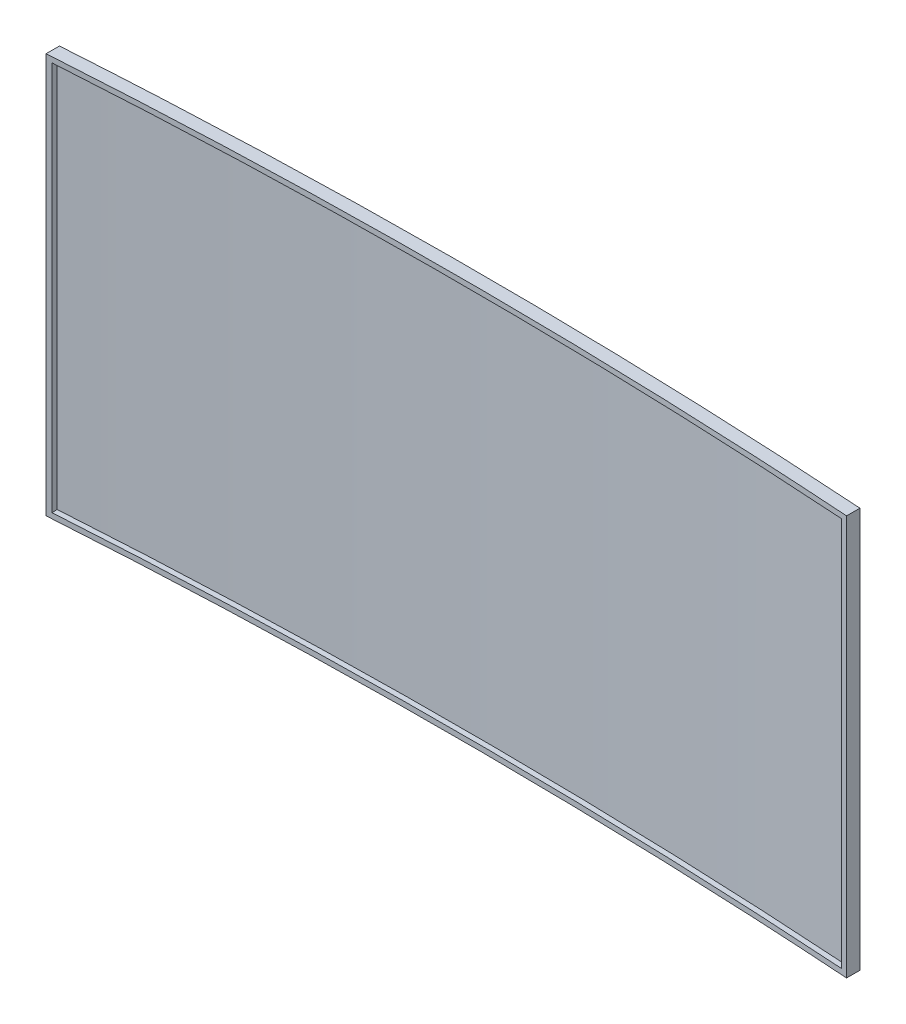
ISO-10303-21;
HEADER;
FILE_DESCRIPTION(('STEP AP214'),'2;1');
FILE_NAME('part.step','',(''),(''),'','','');
FILE_SCHEMA(('AUTOMOTIVE_DESIGN { 1 0 10303 214 1 1 1 1 }'));
ENDSEC;
DATA;
#1=APPLICATION_CONTEXT('core data for automotive mechanical design processes');
#2=APPLICATION_PROTOCOL_DEFINITION('international standard','automotive_design',2000,#1);
#3=PRODUCT_CONTEXT('',#1,'mechanical');
#4=PRODUCT('Part','Part','',(#3));
#5=PRODUCT_RELATED_PRODUCT_CATEGORY('part','',(#4));
#6=PRODUCT_DEFINITION_FORMATION('','',#4);
#7=PRODUCT_DEFINITION_CONTEXT('part definition',#1,'design');
#8=PRODUCT_DEFINITION('design','',#6,#7);
#9=PRODUCT_DEFINITION_SHAPE('','',#8);
#10=(LENGTH_UNIT() NAMED_UNIT(*) SI_UNIT(.MILLI.,.METRE.));
#11=(NAMED_UNIT(*) PLANE_ANGLE_UNIT() SI_UNIT($,.RADIAN.));
#12=(NAMED_UNIT(*) SI_UNIT($,.STERADIAN.) SOLID_ANGLE_UNIT());
#13=UNCERTAINTY_MEASURE_WITH_UNIT(LENGTH_MEASURE(1.E-05),#10,'distance_accuracy_value','');
#14=(GEOMETRIC_REPRESENTATION_CONTEXT(3) GLOBAL_UNCERTAINTY_ASSIGNED_CONTEXT((#13)) GLOBAL_UNIT_ASSIGNED_CONTEXT((#10,
#11,#12)) REPRESENTATION_CONTEXT('',''));
#15=CARTESIAN_POINT('',(0.,0.,0.));
#16=DIRECTION('',(0.,0.,1.));
#17=DIRECTION('',(1.,0.,0.));
#18=AXIS2_PLACEMENT_3D('',#15,#16,#17);
#19=CARTESIAN_POINT('',(-26.,100.,-30.4371187248251));
#20=DIRECTION('',(0.,0.,1.));
#21=DIRECTION('',(1.,0.,0.));
#22=AXIS2_PLACEMENT_3D('',#19,#20,#21);
#23=PLANE('',#22);
#24=CARTESIAN_POINT('',(0.,74.,-30.4371187248251));
#25=DIRECTION('',(0.,0.,-1.));
#26=DIRECTION('',(-1.,0.,0.));
#27=AXIS2_PLACEMENT_3D('',#24,#25,#26);
#28=CIRCLE('',#27,25.);
#29=CARTESIAN_POINT('',(-25.,74.,-30.4371187248251));
#30=VERTEX_POINT('',#29);
#31=EDGE_CURVE('E511',#30,#30,#28,.T.);
#32=ORIENTED_EDGE('',*,*,#31,.F.);
#33=EDGE_LOOP('',(#32));
#34=FACE_BOUND('',#33,.T.);
#35=DIRECTION('',(0.,-1.,0.));
#36=VECTOR('',#35,1.);
#37=CARTESIAN_POINT('',(-26.,100.,-30.4371187248251));
#38=LINE('',#37,#36);
#39=CARTESIAN_POINT('',(-26.,90.,-30.4371187248251));
#40=VERTEX_POINT('',#39);
#41=CARTESIAN_POINT('',(-26.,58.,-30.4371187248251));
#42=VERTEX_POINT('',#41);
#43=EDGE_CURVE('E238',#40,#42,#38,.T.);
#44=ORIENTED_EDGE('',*,*,#43,.F.);
#45=CARTESIAN_POINT('',(-16.,90.,-30.4371187248251));
#46=DIRECTION('',(0.,0.,1.));
#47=DIRECTION('',(1.,0.,0.));
#48=AXIS2_PLACEMENT_3D('',#45,#46,#47);
#49=CIRCLE('',#48,10.);
#50=CARTESIAN_POINT('',(-16.,100.,-30.4371187248251));
#51=VERTEX_POINT('',#50);
#52=EDGE_CURVE('E480',#40,#51,#49,.F.);
#53=ORIENTED_EDGE('',*,*,#52,.T.);
#54=DIRECTION('',(-1.,0.,0.));
#55=VECTOR('',#54,1.);
#56=CARTESIAN_POINT('',(-26.,100.,-30.4371187248251));
#57=LINE('',#56,#55);
#58=CARTESIAN_POINT('',(16.,100.,-30.4371187248251));
#59=VERTEX_POINT('',#58);
#60=EDGE_CURVE('E233',#59,#51,#57,.T.);
#61=ORIENTED_EDGE('',*,*,#60,.F.);
#62=CARTESIAN_POINT('',(16.,90.,-30.4371187248251));
#63=DIRECTION('',(0.,0.,1.));
#64=DIRECTION('',(1.,0.,0.));
#65=AXIS2_PLACEMENT_3D('',#62,#63,#64);
#66=CIRCLE('',#65,10.);
#67=CARTESIAN_POINT('',(26.,90.,-30.4371187248251));
#68=VERTEX_POINT('',#67);
#69=EDGE_CURVE('E471',#59,#68,#66,.F.);
#70=ORIENTED_EDGE('',*,*,#69,.T.);
#71=DIRECTION('',(0.,-1.,0.));
#72=VECTOR('',#71,1.);
#73=CARTESIAN_POINT('',(26.,100.,-30.4371187248251));
#74=LINE('',#73,#72);
#75=CARTESIAN_POINT('',(26.,58.,-30.4371187248251));
#76=VERTEX_POINT('',#75);
#77=EDGE_CURVE('E245',#68,#76,#74,.T.);
#78=ORIENTED_EDGE('',*,*,#77,.T.);
#79=CARTESIAN_POINT('',(16.,58.,-30.4371187248251));
#80=DIRECTION('',(0.,0.,1.));
#81=DIRECTION('',(1.,0.,0.));
#82=AXIS2_PLACEMENT_3D('',#79,#80,#81);
#83=CIRCLE('',#82,10.);
#84=CARTESIAN_POINT('',(16.,48.,-30.4371187248251));
#85=VERTEX_POINT('',#84);
#86=EDGE_CURVE('E474',#76,#85,#83,.F.);
#87=ORIENTED_EDGE('',*,*,#86,.T.);
#88=DIRECTION('',(1.,0.,0.));
#89=VECTOR('',#88,1.);
#90=CARTESIAN_POINT('',(26.,48.,-30.4371187248251));
#91=LINE('',#90,#89);
#92=CARTESIAN_POINT('',(-16.,48.,-30.4371187248251));
#93=VERTEX_POINT('',#92);
#94=EDGE_CURVE('E214',#93,#85,#91,.T.);
#95=ORIENTED_EDGE('',*,*,#94,.F.);
#96=CARTESIAN_POINT('',(-16.,58.,-30.4371187248251));
#97=DIRECTION('',(0.,0.,1.));
#98=DIRECTION('',(1.,0.,0.));
#99=AXIS2_PLACEMENT_3D('',#96,#97,#98);
#100=CIRCLE('',#99,10.);
#101=EDGE_CURVE('E477',#93,#42,#100,.F.);
#102=ORIENTED_EDGE('',*,*,#101,.T.);
#103=EDGE_LOOP('',(#44,#53,#61,#70,#78,#87,#95,#102));
#104=FACE_BOUND('',#103,.T.);
#105=ADVANCED_FACE('F77',(#34,#104),#23,.F.);
#106=CARTESIAN_POINT('',(150.,150.,-18.5826903723583));
#107=CARTESIAN_POINT('',(0.,150.,-28.5826903723583));
#108=CARTESIAN_POINT('',(-150.,150.,-18.5826903723583));
#109=B_SPLINE_CURVE_WITH_KNOTS('',2,(#106,#107,#108),.UNSPECIFIED.,.F.,.F.,(3,3),(0.,1.),.UNSPECIFIED.);
#110=DIRECTION('',(0.,-1.,0.));
#111=VECTOR('',#110,1.);
#112=SURFACE_OF_LINEAR_EXTRUSION('',#109,#111);
#113=CARTESIAN_POINT('',(150.,100.,-18.5826903723583));
#114=CARTESIAN_POINT('',(0.,100.,-28.5826903723583));
#115=CARTESIAN_POINT('',(-150.,100.,-18.5826903723583));
#116=B_SPLINE_CURVE_WITH_KNOTS('',2,(#113,#114,#115),.UNSPECIFIED.,.F.,.F.,(3,3),(0.,1.),.UNSPECIFIED.);
#117=CARTESIAN_POINT('',(-15.9999999999971,100.,-23.5258014834694));
#118=VERTEX_POINT('',#117);
#119=CARTESIAN_POINT('',(16.0000000000008,100.,-23.5258014834694));
#120=VERTEX_POINT('',#119);
#121=EDGE_CURVE('E447',#118,#120,#116,.F.);
#122=ORIENTED_EDGE('',*,*,#121,.F.);
#123=CARTESIAN_POINT('',(-15.9999999999963,100.,-23.5258014834694));
#124=CARTESIAN_POINT('',(-16.2812700377519,100.000030240615,-23.5238018727079));
#125=CARTESIAN_POINT('',(-16.5625353328598,99.9881343444285,-23.5217485084236));
#126=CARTESIAN_POINT('',(-17.1230527161565,99.9407088970849,-23.5175523649435));
#127=CARTESIAN_POINT('',(-17.4023049004997,99.9051804823767,-23.5154095900522));
#128=CARTESIAN_POINT('',(-17.9566102362301,99.8107442761435,-23.5110541681538));
#129=CARTESIAN_POINT('',(-18.2316664015334,99.7518541738374,-23.5088415751764));
#130=CARTESIAN_POINT('',(-18.7758390675748,99.6111231018056,-23.5043663405354));
#131=CARTESIAN_POINT('',(-19.0449556405528,99.5292824113802,-23.5021036994811));
#132=CARTESIAN_POINT('',(-19.57546713897,99.3431843654096,-23.4975507057205));
#133=CARTESIAN_POINT('',(-19.83685832524,99.2389163505439,-23.4952603403274));
#134=CARTESIAN_POINT('',(-20.3499320924614,99.0087263097153,-23.4906783906033));
#135=CARTESIAN_POINT('',(-20.6016144679127,98.8828038257142,-23.4883868062475));
#136=CARTESIAN_POINT('',(-21.0934299111099,98.6102266290479,-23.4838298580343));
#137=CARTESIAN_POINT('',(-21.3335650958013,98.4635757360905,-23.4815644894289));
#138=CARTESIAN_POINT('',(-21.8006275812261,98.1505674386467,-23.4770875244101));
#139=CARTESIAN_POINT('',(-22.0275549530345,97.9842101402205,-23.4748759277073));
#140=CARTESIAN_POINT('',(-22.4665899617938,97.6329708745172,-23.4705349357091));
#141=CARTESIAN_POINT('',(-22.6786976132361,97.4480889253546,-23.4684055403333));
#142=CARTESIAN_POINT('',(-23.0865856586493,97.0611142383118,-23.4642572985002));
#143=CARTESIAN_POINT('',(-23.2823660527151,96.8590215005318,-23.4622384520423));
#144=CARTESIAN_POINT('',(-23.6562459115901,96.4390186777379,-23.4583385934428));
#145=CARTESIAN_POINT('',(-23.8343417686966,96.2211053809113,-23.456457609446));
#146=CARTESIAN_POINT('',(-24.1715379295971,95.7710510174814,-23.4528604146477));
#147=CARTESIAN_POINT('',(-24.3306385263816,95.5389101704131,-23.4511442013048));
#148=CARTESIAN_POINT('',(-24.6287427481667,95.0620042611856,-23.4479008751026));
#149=CARTESIAN_POINT('',(-24.7677427414398,94.8172369285157,-23.4463737964229));
#150=CARTESIAN_POINT('',(-25.024620035839,94.3168654795619,-23.4435314604126));
#151=CARTESIAN_POINT('',(-25.1424976899098,94.061261544441,-23.4422161995428));
#152=CARTESIAN_POINT('',(-25.3562462213088,93.541137665069,-23.4398175305851));
#153=CARTESIAN_POINT('',(-25.4521271930131,93.2766218746805,-23.4387340161633));
#154=CARTESIAN_POINT('',(-25.6212456637034,92.7405575183852,-23.4368145713373));
#155=CARTESIAN_POINT('',(-25.6944886089863,92.4690106610892,-23.4359785813854));
#156=CARTESIAN_POINT('',(-25.8371610175636,91.8347464494576,-23.4343454449056));
#157=CARTESIAN_POINT('',(-25.8982235858673,91.4700923125069,-23.433642331853));
#158=CARTESIAN_POINT('',(-25.9592822305231,90.9201842099516,-23.4329383746383));
#159=CARTESIAN_POINT('',(-25.9745458972698,90.7364870631051,-23.4327621748974));
#160=CARTESIAN_POINT('',(-25.9949035570146,90.3685416677829,-23.4325270502003));
#161=CARTESIAN_POINT('',(-25.9999981955281,90.1842934550318,-23.4324681178002));
#162=CARTESIAN_POINT('',(-25.9999999999963,89.9999999999999,-23.4324681501361));
#163=B_SPLINE_CURVE_WITH_KNOTS('',3,(#123,#124,#125,#126,#127,#128,#129,#130,#131,#132,#133,
#134,#135,#136,#137,#138,#139,#140,#141,#142,#143,#144,#145,#146,#147,#148,#149,#150,#151,#152,
#153,#154,#155,#156,#157,#158,#159,#160,#161,#162),.UNSPECIFIED.,.F.,.F.,(4,2,2,2,2,2,2,2,2,2,2,
2,2,2,2,2,2,2,2,4),(0.,0.843573839903648,1.68710711666889,2.53000289451086,3.37288841506485,
4.21617543328987,5.05948029103054,5.90262995168036,6.74577507468545,7.58891937321444,
8.43206366683826,9.27537961275928,10.1186825493613,10.962137662004,11.8055786795757,
12.648631860569,13.4914820601626,14.5981059641976,15.1508607169053,15.7035803804173),.UNSPECIFIED.);
#164=CARTESIAN_POINT('',(-25.9999999999962,90.,-23.4324681500858));
#165=VERTEX_POINT('',#164);
#166=EDGE_CURVE('E379',#118,#165,#163,.T.);
#167=ORIENTED_EDGE('',*,*,#166,.T.);
#168=DIRECTION('',(0.,-1.,0.));
#169=VECTOR('',#168,1.);
#170=CARTESIAN_POINT('',(-25.9999999999962,100.,-23.4324681500858));
#171=LINE('',#170,#169);
#172=CARTESIAN_POINT('',(-25.9999999999962,0.,-23.4324681500858));
#173=VERTEX_POINT('',#172);
#174=EDGE_CURVE('E251',#165,#173,#171,.T.);
#175=ORIENTED_EDGE('',*,*,#174,.T.);
#176=CARTESIAN_POINT('',(150.,0.,-18.5826903723583));
#177=CARTESIAN_POINT('',(0.,0.,-28.5826903723583));
#178=CARTESIAN_POINT('',(-150.,0.,-18.5826903723583));
#179=B_SPLINE_CURVE_WITH_KNOTS('',2,(#176,#177,#178),.UNSPECIFIED.,.F.,.F.,(3,3),(0.,1.),.UNSPECIFIED.);
#180=CARTESIAN_POINT('',(-150.,0.,-18.5826903723583));
#181=VERTEX_POINT('',#180);
#182=EDGE_CURVE('E421',#173,#181,#179,.T.);
#183=ORIENTED_EDGE('',*,*,#182,.T.);
#184=DIRECTION('',(0.,-1.,0.));
#185=VECTOR('',#184,1.);
#186=CARTESIAN_POINT('',(-150.,150.,-18.5826903723583));
#187=LINE('',#186,#185);
#188=CARTESIAN_POINT('',(-150.,150.,-18.5826903723583));
#189=VERTEX_POINT('',#188);
#190=EDGE_CURVE('E435',#189,#181,#187,.T.);
#191=ORIENTED_EDGE('',*,*,#190,.F.);
#192=CARTESIAN_POINT('',(150.,150.,-18.5826903723583));
#193=VERTEX_POINT('',#192);
#194=EDGE_CURVE('E397',#193,#189,#109,.T.);
#195=ORIENTED_EDGE('',*,*,#194,.F.);
#196=DIRECTION('',(0.,-1.,0.));
#197=VECTOR('',#196,1.);
#198=CARTESIAN_POINT('',(150.,150.,-18.5826903723583));
#199=LINE('',#198,#197);
#200=CARTESIAN_POINT('',(150.,0.,-18.5826903723583));
#201=VERTEX_POINT('',#200);
#202=EDGE_CURVE('E439',#193,#201,#199,.T.);
#203=ORIENTED_EDGE('',*,*,#202,.T.);
#204=CARTESIAN_POINT('',(26.,0.,-23.4324681501361));
#205=VERTEX_POINT('',#204);
#206=EDGE_CURVE('E422',#201,#205,#179,.T.);
#207=ORIENTED_EDGE('',*,*,#206,.T.);
#208=DIRECTION('',(0.,-1.,0.));
#209=VECTOR('',#208,1.);
#210=CARTESIAN_POINT('',(26.,100.,-23.4324681500858));
#211=LINE('',#210,#209);
#212=CARTESIAN_POINT('',(26.,90.,-23.4324681500858));
#213=VERTEX_POINT('',#212);
#214=EDGE_CURVE('E230',#213,#205,#211,.T.);
#215=ORIENTED_EDGE('',*,*,#214,.F.);
#216=CARTESIAN_POINT('',(26.,90.,-23.4324681500858));
#217=CARTESIAN_POINT('',(26.0000302538294,90.2812484502844,-23.4324674032675));
#218=CARTESIAN_POINT('',(25.9881361662323,90.5624925473369,-23.4326052308478));
#219=CARTESIAN_POINT('',(25.9407178278026,91.1229683689382,-23.4331526386457));
#220=CARTESIAN_POINT('',(25.9051947147067,91.4022001897237,-23.4335622057791));
#221=CARTESIAN_POINT('',(25.8107726008672,91.9564651390475,-23.4346472861394));
#222=CARTESIAN_POINT('',(25.751891337188,92.2315012893926,-23.4353225975698));
#223=CARTESIAN_POINT('',(25.611181423171,92.7756349457555,-23.4369286756622));
#224=CARTESIAN_POINT('',(25.5293530521309,93.0447325240109,-23.437859439215));
#225=CARTESIAN_POINT('',(25.3432832182786,93.5752070697886,-23.4399629587109));
#226=CARTESIAN_POINT('',(25.2390311062496,93.8365803016415,-23.4411358296221));
#227=CARTESIAN_POINT('',(25.0088765115509,94.3496195231991,-23.4437057795443));
#228=CARTESIAN_POINT('',(24.8829735700545,94.6012853070442,-23.4451028633069));
#229=CARTESIAN_POINT('',(24.6104391438661,95.0930693193879,-23.4481003367357));
#230=CARTESIAN_POINT('',(24.4638114699254,95.3331896599459,-23.4497006890205));
#231=CARTESIAN_POINT('',(24.1508534065322,95.8002245083588,-23.4530816511351));
#232=CARTESIAN_POINT('',(23.9845231225691,96.0271390869086,-23.4548622599999));
#233=CARTESIAN_POINT('',(23.6333365201579,96.4661575228796,-23.4585784228328));
#234=CARTESIAN_POINT('',(23.44847967565,96.6782609594496,-23.4605139812005));
#235=CARTESIAN_POINT('',(23.0615579029845,97.0861427496333,-23.4645130306764));
#236=CARTESIAN_POINT('',(22.859492973565,97.2819211020499,-23.466576521794));
#237=CARTESIAN_POINT('',(22.4395483269344,97.6557996240447,-23.4708038737284));
#238=CARTESIAN_POINT('',(22.2216653954716,97.8338961831398,-23.4729677549121));
#239=CARTESIAN_POINT('',(21.7716740653589,98.1710970557617,-23.4773669990361));
#240=CARTESIAN_POINT('',(21.5395658851146,98.330201660769,-23.4796023608787));
#241=CARTESIAN_POINT('',(21.0627064848311,98.6283307226073,-23.484116871495));
#242=CARTESIAN_POINT('',(20.8179519034553,98.7673498031662,-23.486396031808));
#243=CARTESIAN_POINT('',(20.3176054680057,99.0242659613605,-23.4909698151023));
#244=CARTESIAN_POINT('',(20.0620137941063,99.1421633899884,-23.493264437826));
#245=CARTESIAN_POINT('',(19.5419134430466,99.3559524763882,-23.4978417454951));
#246=CARTESIAN_POINT('',(19.2774089126351,99.4518542099605,-23.5001244354365));
#247=CARTESIAN_POINT('',(18.7413658969709,99.6210152587688,-23.5046532828295));
#248=CARTESIAN_POINT('',(18.4698291190538,99.6942800151286,-23.5068994489369));
#249=CARTESIAN_POINT('',(17.8354432904454,99.8370363059203,-23.5120295662459));
#250=CARTESIAN_POINT('',(17.4706531532285,99.8981455284138,-23.5148927236988));
#251=CARTESIAN_POINT('',(16.9205370540761,99.9592509363462,-23.5190746279739));
#252=CARTESIAN_POINT('',(16.7367698864531,99.9745263211353,-23.5204491264351));
#253=CARTESIAN_POINT('',(16.3686836083456,99.9948996239054,-23.5231570570484));
#254=CARTESIAN_POINT('',(16.1843645337291,99.9999981894856,-23.5244904918083));
#255=CARTESIAN_POINT('',(16.,100.,-23.5258014834694));
#256=B_SPLINE_CURVE_WITH_KNOTS('',3,(#216,#217,#218,#219,#220,#221,#222,#223,#224,#225,#226,
#227,#228,#229,#230,#231,#232,#233,#234,#235,#236,#237,#238,#239,#240,#241,#242,#243,#244,#245,
#246,#247,#248,#249,#250,#251,#252,#253,#254,#255),.UNSPECIFIED.,.F.,.F.,(4,2,2,2,2,2,2,2,2,2,2,
2,2,2,2,2,2,2,2,4),(0.,0.843487785213372,1.68693495946407,2.5297428824276,3.37254054770891,
4.21573935167457,5.05895602699874,5.90201785743875,6.74507517425999,7.58815643639231,
8.43123776034621,9.27449088233718,10.1177310607791,10.9611965319655,11.8046479854243,
12.6477122950431,13.4905738040782,14.5976517396412,15.1506336302389,15.7035803308566),.UNSPECIFIED.);
#257=EDGE_CURVE('E12',#213,#120,#256,.T.);
#258=ORIENTED_EDGE('',*,*,#257,.T.);
#259=EDGE_LOOP('',(#122,#167,#175,#183,#191,#195,#203,#207,#215,#258));
#260=FACE_BOUND('',#259,.T.);
#261=ADVANCED_FACE('F369',(#260),#112,.F.);
#262=CARTESIAN_POINT('',(-150.,150.,-13.5826903723583));
#263=CARTESIAN_POINT('',(0.,150.,-23.5826903723583));
#264=CARTESIAN_POINT('',(150.,150.,-13.5826903723583));
#265=B_SPLINE_CURVE_WITH_KNOTS('',2,(#262,#263,#264),.UNSPECIFIED.,.F.,.F.,(3,3),(0.,1.),.UNSPECIFIED.);
#266=DIRECTION('',(0.,-1.,0.));
#267=VECTOR('',#266,1.);
#268=SURFACE_OF_LINEAR_EXTRUSION('',#265,#267);
#269=CARTESIAN_POINT('',(147.893499940002,148.,-13.7221376335798));
#270=CARTESIAN_POINT('',(135.575125190761,148.,-14.5318687173323));
#271=CARTESIAN_POINT('',(123.250116631545,148.,-15.2407979751318));
#272=CARTESIAN_POINT('',(98.6000927984287,148.,-16.4559699640982));
#273=CARTESIAN_POINT('',(86.2750855714787,148.,-16.9623759522553));
#274=CARTESIAN_POINT('',(61.6250630018723,148.,-17.7725099127784));
#275=CARTESIAN_POINT('',(49.3000512482122,148.,-18.0763470414892));
#276=CARTESIAN_POINT('',(24.6500257307737,148.,-18.4814099396221));
#277=CARTESIAN_POINT('',(12.3250128653868,148.,-18.5826903723583));
#278=CARTESIAN_POINT('',(-12.3250128653869,148.,-18.5826903723583));
#279=CARTESIAN_POINT('',(-24.6500257307738,148.,-18.4814099396221));
#280=CARTESIAN_POINT('',(-49.3000512482123,148.,-18.0763470414892));
#281=CARTESIAN_POINT('',(-61.6250630018724,148.,-17.7725099127784));
#282=CARTESIAN_POINT('',(-86.2750855714788,148.,-16.9623759522553));
#283=CARTESIAN_POINT('',(-98.6000927984288,148.,-16.4559699640982));
#284=CARTESIAN_POINT('',(-123.250116631545,148.,-15.2407979751318));
#285=CARTESIAN_POINT('',(-135.575125190761,148.,-14.5318687173323));
#286=CARTESIAN_POINT('',(-147.893499940002,148.,-13.7221376335798));
#287=B_SPLINE_CURVE_WITH_KNOTS('',3,(#269,#270,#271,#272,#273,#274,#275,#276,#277,#278,#279,
#280,#281,#282,#283,#284,#285,#286),.UNSPECIFIED.,.F.,.F.,(4,2,2,2,2,2,2,2,4),(0.,
37.0344761709365,74.0390378362745,111.023643055688,147.998266012954,184.97288897022,
221.957494189634,258.962055854972,295.996532025908),.UNSPECIFIED.);
#288=CARTESIAN_POINT('',(147.893499940002,148.,-13.7221376335798));
#289=VERTEX_POINT('',#288);
#290=CARTESIAN_POINT('',(-147.893499940002,148.,-13.7221376335798));
#291=VERTEX_POINT('',#290);
#292=EDGE_CURVE('E255',#289,#291,#287,.T.);
#293=ORIENTED_EDGE('',*,*,#292,.F.);
#294=DIRECTION('',(0.,1.,0.));
#295=VECTOR('',#294,1.);
#296=CARTESIAN_POINT('',(147.893499572419,2.,-13.7221320413026));
#297=LINE('',#296,#295);
#298=CARTESIAN_POINT('',(147.893499572419,2.,-13.7221320413026));
#299=VERTEX_POINT('',#298);
#300=EDGE_CURVE('E262',#299,#289,#297,.T.);
#301=ORIENTED_EDGE('',*,*,#300,.F.);
#302=CARTESIAN_POINT('',(-147.893499940002,2.,-13.7221376335798));
#303=CARTESIAN_POINT('',(-135.575125190761,2.00000000000003,-14.5318687173323));
#304=CARTESIAN_POINT('',(-123.250116631545,2.00000000000004,-15.2407979751318));
#305=CARTESIAN_POINT('',(-98.6000927984287,2.00000000000002,-16.4559699640982));
#306=CARTESIAN_POINT('',(-86.2750855714787,2.00000000000001,-16.9623759522553));
#307=CARTESIAN_POINT('',(-61.6250630018723,2.,-17.7725099127784));
#308=CARTESIAN_POINT('',(-49.3000512482123,2.,-18.0763470414892));
#309=CARTESIAN_POINT('',(-24.6500257307738,2.,-18.4814099396221));
#310=CARTESIAN_POINT('',(-12.3250128653869,2.,-18.5826903723583));
#311=CARTESIAN_POINT('',(12.3250128653869,2.,-18.5826903723583));
#312=CARTESIAN_POINT('',(24.6500257307737,2.,-18.4814099396221));
#313=CARTESIAN_POINT('',(49.3000512482123,2.,-18.0763470414892));
#314=CARTESIAN_POINT('',(61.6250630018724,2.,-17.7725099127784));
#315=CARTESIAN_POINT('',(86.2750855714787,2.,-16.9623759522553));
#316=CARTESIAN_POINT('',(98.6000927984287,2.,-16.4559699640982));
#317=CARTESIAN_POINT('',(123.250116631545,2.,-15.2407979751318));
#318=CARTESIAN_POINT('',(135.575125190761,2.,-14.5318687173323));
#319=CARTESIAN_POINT('',(147.893499940002,2.,-13.7221376335798));
#320=B_SPLINE_CURVE_WITH_KNOTS('',3,(#302,#303,#304,#305,#306,#307,#308,#309,#310,#311,#312,
#313,#314,#315,#316,#317,#318,#319),.UNSPECIFIED.,.F.,.F.,(4,2,2,2,2,2,2,2,4),(0.,
37.0344761709364,74.0390378362745,111.023643055688,147.998266012954,184.97288897022,
221.957494189634,258.962055854971,295.996532025908),.UNSPECIFIED.);
#321=CARTESIAN_POINT('',(-147.893499940003,2.,-13.7221376335797));
#322=VERTEX_POINT('',#321);
#323=EDGE_CURVE('E288',#322,#299,#320,.T.);
#324=ORIENTED_EDGE('',*,*,#323,.F.);
#325=DIRECTION('',(0.,-1.,0.));
#326=VECTOR('',#325,1.);
#327=CARTESIAN_POINT('',(-147.893499572419,148.,-13.7221320413026));
#328=LINE('',#327,#326);
#329=EDGE_CURVE('E290',#291,#322,#328,.T.);
#330=ORIENTED_EDGE('',*,*,#329,.F.);
#331=EDGE_LOOP('',(#293,#301,#324,#330));
#332=FACE_BOUND('',#331,.T.);
#333=CARTESIAN_POINT('',(-150.,0.,-13.5826903723583));
#334=CARTESIAN_POINT('',(0.,0.,-23.5826903723583));
#335=CARTESIAN_POINT('',(150.,0.,-13.5826903723583));
#336=B_SPLINE_CURVE_WITH_KNOTS('',2,(#333,#334,#335),.UNSPECIFIED.,.F.,.F.,(3,3),(0.,1.),.UNSPECIFIED.);
#337=CARTESIAN_POINT('',(-150.,0.,-13.5826903723583));
#338=VERTEX_POINT('',#337);
#339=CARTESIAN_POINT('',(150.,0.,-13.5826903723583));
#340=VERTEX_POINT('',#339);
#341=EDGE_CURVE('E346',#338,#340,#336,.T.);
#342=ORIENTED_EDGE('',*,*,#341,.T.);
#343=DIRECTION('',(0.,-1.,0.));
#344=VECTOR('',#343,1.);
#345=CARTESIAN_POINT('',(150.,150.,-13.5826903723583));
#346=LINE('',#345,#344);
#347=CARTESIAN_POINT('',(150.,150.,-13.5826903723583));
#348=VERTEX_POINT('',#347);
#349=EDGE_CURVE('E443',#348,#340,#346,.T.);
#350=ORIENTED_EDGE('',*,*,#349,.F.);
#351=CARTESIAN_POINT('',(-150.,150.,-13.5826903723583));
#352=VERTEX_POINT('',#351);
#353=EDGE_CURVE('E350',#352,#348,#265,.T.);
#354=ORIENTED_EDGE('',*,*,#353,.F.);
#355=DIRECTION('',(0.,-1.,0.));
#356=VECTOR('',#355,1.);
#357=CARTESIAN_POINT('',(-150.,150.,-13.5826903723583));
#358=LINE('',#357,#356);
#359=EDGE_CURVE('E409',#352,#338,#358,.T.);
#360=ORIENTED_EDGE('',*,*,#359,.T.);
#361=EDGE_LOOP('',(#342,#350,#354,#360));
#362=FACE_BOUND('',#361,.T.);
#363=ADVANCED_FACE('F364',(#332,#362),#268,.F.);
#364=CARTESIAN_POINT('',(150.,150.,-13.5826903723583));
#365=DIRECTION('',(-1.,0.,0.));
#366=DIRECTION('',(0.,0.,1.));
#367=AXIS2_PLACEMENT_3D('',#364,#365,#366);
#368=PLANE('',#367);
#369=DIRECTION('',(0.,0.,-1.));
#370=VECTOR('',#369,1.);
#371=CARTESIAN_POINT('',(150.,0.,-13.5826903723583));
#372=LINE('',#371,#370);
#373=EDGE_CURVE('E415',#340,#201,#372,.T.);
#374=ORIENTED_EDGE('',*,*,#373,.T.);
#375=ORIENTED_EDGE('',*,*,#202,.F.);
#376=DIRECTION('',(0.,0.,-1.));
#377=VECTOR('',#376,1.);
#378=CARTESIAN_POINT('',(150.,150.,-13.5826903723583));
#379=LINE('',#378,#377);
#380=EDGE_CURVE('E357',#348,#193,#379,.T.);
#381=ORIENTED_EDGE('',*,*,#380,.F.);
#382=ORIENTED_EDGE('',*,*,#349,.T.);
#383=EDGE_LOOP('',(#374,#375,#381,#382));
#384=FACE_BOUND('',#383,.T.);
#385=ADVANCED_FACE('F368',(#384),#368,.F.);
#386=CARTESIAN_POINT('',(-150.,150.,-13.5826903723583));
#387=DIRECTION('',(1.,0.,0.));
#388=DIRECTION('',(0.,0.,-1.));
#389=AXIS2_PLACEMENT_3D('',#386,#387,#388);
#390=PLANE('',#389);
#391=DIRECTION('',(0.,0.,1.));
#392=VECTOR('',#391,1.);
#393=CARTESIAN_POINT('',(-150.,0.,-13.5826903723583));
#394=LINE('',#393,#392);
#395=EDGE_CURVE('E358',#181,#338,#394,.T.);
#396=ORIENTED_EDGE('',*,*,#395,.T.);
#397=ORIENTED_EDGE('',*,*,#359,.F.);
#398=DIRECTION('',(0.,0.,1.));
#399=VECTOR('',#398,1.);
#400=CARTESIAN_POINT('',(-150.,150.,-13.5826903723583));
#401=LINE('',#400,#399);
#402=EDGE_CURVE('E403',#189,#352,#401,.T.);
#403=ORIENTED_EDGE('',*,*,#402,.F.);
#404=ORIENTED_EDGE('',*,*,#190,.T.);
#405=EDGE_LOOP('',(#396,#397,#403,#404));
#406=FACE_BOUND('',#405,.T.);
#407=ADVANCED_FACE('F394',(#406),#390,.F.);
#408=CARTESIAN_POINT('',(0.,150.,-18.5826903723583));
#409=DIRECTION('',(0.,-1.,0.));
#410=DIRECTION('',(0.,0.,-1.));
#411=AXIS2_PLACEMENT_3D('',#408,#409,#410);
#412=PLANE('',#411);
#413=ORIENTED_EDGE('',*,*,#353,.T.);
#414=ORIENTED_EDGE('',*,*,#380,.T.);
#415=ORIENTED_EDGE('',*,*,#194,.T.);
#416=ORIENTED_EDGE('',*,*,#402,.T.);
#417=EDGE_LOOP('',(#413,#414,#415,#416));
#418=FACE_BOUND('',#417,.T.);
#419=ADVANCED_FACE('F558',(#418),#412,.F.);
#420=CARTESIAN_POINT('',(0.,0.,-18.5826903723583));
#421=DIRECTION('',(0.,-1.,0.));
#422=DIRECTION('',(0.,0.,-1.));
#423=AXIS2_PLACEMENT_3D('',#420,#421,#422);
#424=PLANE('',#423);
#425=DIRECTION('',(-1.,0.,0.));
#426=VECTOR('',#425,1.);
#427=CARTESIAN_POINT('',(26.,0.,-23.4938014834191));
#428=LINE('',#427,#426);
#429=CARTESIAN_POINT('',(26.,0.,-23.4938014834191));
#430=VERTEX_POINT('',#429);
#431=CARTESIAN_POINT('',(-26.,0.,-23.4938014834191));
#432=VERTEX_POINT('',#431);
#433=EDGE_CURVE('E208',#430,#432,#428,.T.);
#434=ORIENTED_EDGE('',*,*,#433,.F.);
#435=DIRECTION('',(0.,0.,-1.));
#436=VECTOR('',#435,1.);
#437=CARTESIAN_POINT('',(26.,0.,-23.4324681500858));
#438=LINE('',#437,#436);
#439=EDGE_CURVE('E221',#205,#430,#438,.T.);
#440=ORIENTED_EDGE('',*,*,#439,.F.);
#441=ORIENTED_EDGE('',*,*,#206,.F.);
#442=ORIENTED_EDGE('',*,*,#373,.F.);
#443=ORIENTED_EDGE('',*,*,#341,.F.);
#444=ORIENTED_EDGE('',*,*,#395,.F.);
#445=ORIENTED_EDGE('',*,*,#182,.F.);
#446=DIRECTION('',(5.35426016622026E-13,0.,1.));
#447=VECTOR('',#446,1.);
#448=CARTESIAN_POINT('',(-25.9999999999962,0.,-23.4324681500858));
#449=LINE('',#448,#447);
#450=EDGE_CURVE('E224',#432,#173,#449,.T.);
#451=ORIENTED_EDGE('',*,*,#450,.F.);
#452=EDGE_LOOP('',(#434,#440,#441,#442,#443,#444,#445,#451));
#453=FACE_BOUND('',#452,.T.);
#454=ADVANCED_FACE('F219',(#453),#424,.T.);
#455=CARTESIAN_POINT('',(147.893499572419,2.,-13.7221320413026));
#456=DIRECTION('',(0.997846729222332,0.,0.0655889089731889));
#457=DIRECTION('',(0.,-1.,0.));
#458=AXIS2_PLACEMENT_3D('',#455,#456,#457);
#459=PLANE('',#458);
#460=DIRECTION('',(-0.0655889089731889,0.,0.997846729222332));
#461=VECTOR('',#460,1.);
#462=CARTESIAN_POINT('',(147.893499572419,2.,-13.7221320413026));
#463=LINE('',#462,#461);
#464=CARTESIAN_POINT('',(148.024677757947,2.,-15.7178310920245));
#465=VERTEX_POINT('',#464);
#466=EDGE_CURVE('E343',#465,#299,#463,.T.);
#467=ORIENTED_EDGE('',*,*,#466,.T.);
#468=ORIENTED_EDGE('',*,*,#300,.T.);
#469=DIRECTION('',(-0.0655889089678592,0.,0.997846729222683));
#470=VECTOR('',#469,1.);
#471=CARTESIAN_POINT('',(147.893499940002,148.,-13.7221376335798));
#472=LINE('',#471,#470);
#473=CARTESIAN_POINT('',(148.024677759252,148.,-15.7178310919387));
#474=VERTEX_POINT('',#473);
#475=EDGE_CURVE('E340',#474,#289,#472,.T.);
#476=ORIENTED_EDGE('',*,*,#475,.F.);
#477=DIRECTION('',(0.,-1.,0.));
#478=VECTOR('',#477,1.);
#479=CARTESIAN_POINT('',(148.024677759252,150.,-15.7178310919387));
#480=LINE('',#479,#478);
#481=EDGE_CURVE('E311',#465,#474,#480,.F.);
#482=ORIENTED_EDGE('',*,*,#481,.F.);
#483=EDGE_LOOP('',(#467,#468,#476,#482));
#484=FACE_BOUND('',#483,.T.);
#485=ADVANCED_FACE('F557',(#484),#459,.F.);
#486=CARTESIAN_POINT('',(147.893499940002,148.,-13.7221376335798));
#487=DIRECTION('',(0.,1.,0.));
#488=DIRECTION('',(0.,0.,1.));
#489=AXIS2_PLACEMENT_3D('',#486,#487,#488);
#490=PLANE('',#489);
#491=ORIENTED_EDGE('',*,*,#475,.T.);
#492=ORIENTED_EDGE('',*,*,#292,.T.);
#493=DIRECTION('',(0.0655889089678592,0.,0.997846729222683));
#494=VECTOR('',#493,1.);
#495=CARTESIAN_POINT('',(-147.893499940002,148.,-13.7221376335798));
#496=LINE('',#495,#494);
#497=CARTESIAN_POINT('',(-148.024677747172,148.,-15.7178310927328));
#498=VERTEX_POINT('',#497);
#499=EDGE_CURVE('E332',#498,#291,#496,.T.);
#500=ORIENTED_EDGE('',*,*,#499,.F.);
#501=CARTESIAN_POINT('',(148.024677757949,148.,-15.7178310920244));
#502=CARTESIAN_POINT('',(135.695407806479,148.,-16.528278331417));
#503=CARTESIAN_POINT('',(123.359498179327,148.,-17.237834505864));
#504=CARTESIAN_POINT('',(98.6876457683089,148.,-18.4540825915205));
#505=CARTESIAN_POINT('',(86.3517110171435,148.,-18.9609374706081));
#506=CARTESIAN_POINT('',(61.6798157080604,148.,-19.771790284919));
#507=CARTESIAN_POINT('',(49.3438587327685,148.,-20.0758971827749));
#508=CARTESIAN_POINT('',(24.6719339071248,148.,-20.4813199433989));
#509=CARTESIAN_POINT('',(12.3359669535682,148.,-20.5826903723582));
#510=CARTESIAN_POINT('',(-12.3359669535535,148.,-20.5826903723583));
#511=CARTESIAN_POINT('',(-24.6719339071184,148.,-20.481319943399));
#512=CARTESIAN_POINT('',(-49.3438587327709,148.,-20.0758971827748));
#513=CARTESIAN_POINT('',(-61.6798157080631,148.,-19.771790284919));
#514=CARTESIAN_POINT('',(-86.3517110171525,148.,-18.9609374706078));
#515=CARTESIAN_POINT('',(-98.6876457683237,148.,-18.4540825915199));
#516=CARTESIAN_POINT('',(-123.359498179345,148.,-17.237834505863));
#517=CARTESIAN_POINT('',(-135.695407806494,148.,-16.5282783314161));
#518=CARTESIAN_POINT('',(-148.024677757961,148.,-15.7178310920236));
#519=B_SPLINE_CURVE_WITH_KNOTS('',3,(#501,#502,#503,#504,#505,#506,#507,#508,#509,#510,#511,
#512,#513,#514,#515,#516,#517,#518),.UNSPECIFIED.,.F.,.F.,(4,2,2,2,2,2,2,2,4),(0.,
37.0672319464191,74.1046023610974,111.122051741045,148.129536593107,185.137021445193,
222.154470825143,259.191841239838,296.259073186249),.UNSPECIFIED.);
#520=EDGE_CURVE('E295',#474,#498,#519,.T.);
#521=ORIENTED_EDGE('',*,*,#520,.F.);
#522=EDGE_LOOP('',(#491,#492,#500,#521));
#523=FACE_BOUND('',#522,.T.);
#524=ADVANCED_FACE('F617',(#523),#490,.F.);
#525=CARTESIAN_POINT('',(-147.893499940002,148.,-13.7221376335798));
#526=DIRECTION('',(0.997846729222683,0.,-0.0655889089678592));
#527=DIRECTION('',(0.,-1.,0.));
#528=AXIS2_PLACEMENT_3D('',#525,#526,#527);
#529=PLANE('',#528);
#530=ORIENTED_EDGE('',*,*,#499,.T.);
#531=ORIENTED_EDGE('',*,*,#329,.T.);
#532=DIRECTION('',(0.0655889089678592,0.,0.997846729222683));
#533=VECTOR('',#532,1.);
#534=CARTESIAN_POINT('',(-147.893499940002,2.,-13.7221376335798));
#535=LINE('',#534,#533);
#536=CARTESIAN_POINT('',(-148.024677747172,2.,-15.7178310927328));
#537=VERTEX_POINT('',#536);
#538=EDGE_CURVE('E261',#537,#322,#535,.T.);
#539=ORIENTED_EDGE('',*,*,#538,.F.);
#540=DIRECTION('',(0.,-1.,0.));
#541=VECTOR('',#540,1.);
#542=CARTESIAN_POINT('',(-148.024677747172,150.,-15.7178310927328));
#543=LINE('',#542,#541);
#544=EDGE_CURVE('E254',#498,#537,#543,.T.);
#545=ORIENTED_EDGE('',*,*,#544,.F.);
#546=EDGE_LOOP('',(#530,#531,#539,#545));
#547=FACE_BOUND('',#546,.T.);
#548=ADVANCED_FACE('F325',(#547),#529,.T.);
#549=CARTESIAN_POINT('',(-147.893499940002,2.,-13.7221376335798));
#550=DIRECTION('',(0.,1.,0.));
#551=DIRECTION('',(0.,0.,1.));
#552=AXIS2_PLACEMENT_3D('',#549,#550,#551);
#553=PLANE('',#552);
#554=CARTESIAN_POINT('',(-148.024677757938,2.,-15.7178310920251));
#555=CARTESIAN_POINT('',(-135.695407806474,2.00000000000003,-16.5282783314172));
#556=CARTESIAN_POINT('',(-123.359498179329,2.00000000000004,-17.2378345058639));
#557=CARTESIAN_POINT('',(-98.6876457683121,2.00000000000002,-18.4540825915204));
#558=CARTESIAN_POINT('',(-86.3517110171408,2.00000000000001,-18.9609374706082));
#559=CARTESIAN_POINT('',(-61.6798157080511,2.,-19.7717902849193));
#560=CARTESIAN_POINT('',(-49.3438587327585,2.,-20.0758971827751));
#561=CARTESIAN_POINT('',(-24.6719339071215,2.,-20.4813199433989));
#562=CARTESIAN_POINT('',(-12.3359669535723,2.,-20.5826903723581));
#563=CARTESIAN_POINT('',(12.3359669535492,2.,-20.5826903723584));
#564=CARTESIAN_POINT('',(24.6719339071215,2.,-20.481319943399));
#565=CARTESIAN_POINT('',(49.3438587327768,2.,-20.0758971827747));
#566=CARTESIAN_POINT('',(61.6798157080645,2.,-19.7717902849189));
#567=CARTESIAN_POINT('',(86.3517110171435,2.,-18.9609374706081));
#568=CARTESIAN_POINT('',(98.6876457683089,2.,-18.4540825915205));
#569=CARTESIAN_POINT('',(123.359498179327,2.,-17.237834505864));
#570=CARTESIAN_POINT('',(135.695407806479,2.,-16.528278331417));
#571=CARTESIAN_POINT('',(148.024677757949,2.,-15.7178310920244));
#572=B_SPLINE_CURVE_WITH_KNOTS('',3,(#554,#555,#556,#557,#558,#559,#560,#561,#562,#563,#564,
#565,#566,#567,#568,#569,#570,#571),.UNSPECIFIED.,.F.,.F.,(4,2,2,2,2,2,2,2,4),(0.,
37.0672319463985,74.1046023610944,111.122051741045,148.129536593084,185.137021445192,
222.154470825128,259.191841239806,296.259073186225),.UNSPECIFIED.);
#573=EDGE_CURVE('E306',#537,#465,#572,.T.);
#574=ORIENTED_EDGE('',*,*,#573,.F.);
#575=ORIENTED_EDGE('',*,*,#538,.T.);
#576=ORIENTED_EDGE('',*,*,#323,.T.);
#577=ORIENTED_EDGE('',*,*,#466,.F.);
#578=EDGE_LOOP('',(#574,#575,#576,#577));
#579=FACE_BOUND('',#578,.T.);
#580=ADVANCED_FACE('F323',(#579),#553,.T.);
#581=CARTESIAN_POINT('',(-150.,150.,-13.5826903723583));
#582=CARTESIAN_POINT('',(0.,150.,-23.5826903723583));
#583=CARTESIAN_POINT('',(150.,150.,-13.5826903723583));
#584=B_SPLINE_CURVE_WITH_KNOTS('',2,(#581,#582,#583),.UNSPECIFIED.,.F.,.F.,(3,3),(0.,1.),.UNSPECIFIED.);
#585=DIRECTION('',(0.,-1.,0.));
#586=VECTOR('',#585,1.);
#587=SURFACE_OF_LINEAR_EXTRUSION('',#584,#586);
#588=OFFSET_SURFACE('',#587,2.,.F.);
#589=ORIENTED_EDGE('',*,*,#544,.T.);
#590=ORIENTED_EDGE('',*,*,#573,.T.);
#591=ORIENTED_EDGE('',*,*,#481,.T.);
#592=ORIENTED_EDGE('',*,*,#520,.T.);
#593=EDGE_LOOP('',(#589,#590,#591,#592));
#594=FACE_BOUND('',#593,.T.);
#595=ADVANCED_FACE('F313',(#594),#588,.F.);
#596=CARTESIAN_POINT('',(0.,100.,0.));
#597=DIRECTION('',(0.,-1.,0.));
#598=DIRECTION('',(0.,0.,-1.));
#599=AXIS2_PLACEMENT_3D('',#596,#597,#598);
#600=PLANE('',#599);
#601=ORIENTED_EDGE('',*,*,#60,.T.);
#602=DIRECTION('',(5.35426016622026E-13,0.,1.));
#603=VECTOR('',#602,1.);
#604=CARTESIAN_POINT('',(-15.9999999999837,100.,8.56681626594369E-12));
#605=LINE('',#604,#603);
#606=EDGE_CURVE('E460',#51,#118,#605,.T.);
#607=ORIENTED_EDGE('',*,*,#606,.T.);
#608=ORIENTED_EDGE('',*,*,#121,.T.);
#609=DIRECTION('',(0.,0.,-1.));
#610=VECTOR('',#609,1.);
#611=CARTESIAN_POINT('',(16.,100.,0.));
#612=LINE('',#611,#610);
#613=EDGE_CURVE('E453',#120,#59,#612,.T.);
#614=ORIENTED_EDGE('',*,*,#613,.T.);
#615=EDGE_LOOP('',(#601,#607,#608,#614));
#616=FACE_BOUND('',#615,.T.);
#617=ADVANCED_FACE('F322',(#616),#600,.F.);
#618=CARTESIAN_POINT('',(-25.9999999999962,100.,-23.4324681500858));
#619=DIRECTION('',(1.,0.,-5.35426016622026E-13));
#620=DIRECTION('',(-5.35426016622026E-13,0.,-1.));
#621=AXIS2_PLACEMENT_3D('',#618,#619,#620);
#622=PLANE('',#621);
#623=ORIENTED_EDGE('',*,*,#174,.F.);
#624=DIRECTION('',(5.35426016622026E-13,0.,1.));
#625=VECTOR('',#624,1.);
#626=CARTESIAN_POINT('',(-25.9999999999962,90.,-23.4324681500858));
#627=LINE('',#626,#625);
#628=EDGE_CURVE('E468',#165,#40,#627,.F.);
#629=ORIENTED_EDGE('',*,*,#628,.T.);
#630=ORIENTED_EDGE('',*,*,#43,.T.);
#631=DIRECTION('',(-5.35426016622026E-13,0.,-1.));
#632=VECTOR('',#631,1.);
#633=CARTESIAN_POINT('',(-25.9999999999963,58.,-23.4938014834191));
#634=LINE('',#633,#632);
#635=CARTESIAN_POINT('',(-26.,58.,-23.4938014834191));
#636=VERTEX_POINT('',#635);
#637=EDGE_CURVE('E464',#42,#636,#634,.F.);
#638=ORIENTED_EDGE('',*,*,#637,.T.);
#639=DIRECTION('',(0.,-1.,0.));
#640=VECTOR('',#639,1.);
#641=CARTESIAN_POINT('',(-26.,48.,-23.4938014834191));
#642=LINE('',#641,#640);
#643=EDGE_CURVE('E213',#636,#432,#642,.T.);
#644=ORIENTED_EDGE('',*,*,#643,.T.);
#645=ORIENTED_EDGE('',*,*,#450,.T.);
#646=EDGE_LOOP('',(#623,#629,#630,#638,#644,#645));
#647=FACE_BOUND('',#646,.T.);
#648=ADVANCED_FACE('F275',(#647),#622,.F.);
#649=CARTESIAN_POINT('',(26.,100.,-23.4324681500858));
#650=DIRECTION('',(-1.,0.,0.));
#651=DIRECTION('',(0.,0.,1.));
#652=AXIS2_PLACEMENT_3D('',#649,#650,#651);
#653=PLANE('',#652);
#654=DIRECTION('',(0.,-1.,0.));
#655=VECTOR('',#654,1.);
#656=CARTESIAN_POINT('',(26.,48.,-23.4938014834191));
#657=LINE('',#656,#655);
#658=CARTESIAN_POINT('',(26.,58.,-23.4938014834191));
#659=VERTEX_POINT('',#658);
#660=EDGE_CURVE('E99',#659,#430,#657,.T.);
#661=ORIENTED_EDGE('',*,*,#660,.F.);
#662=DIRECTION('',(0.,0.,1.));
#663=VECTOR('',#662,1.);
#664=CARTESIAN_POINT('',(26.,58.,-30.4371187248251));
#665=LINE('',#664,#663);
#666=EDGE_CURVE('E388',#659,#76,#665,.F.);
#667=ORIENTED_EDGE('',*,*,#666,.T.);
#668=ORIENTED_EDGE('',*,*,#77,.F.);
#669=DIRECTION('',(0.,0.,-1.));
#670=VECTOR('',#669,1.);
#671=CARTESIAN_POINT('',(26.,90.,-23.4324681500858));
#672=LINE('',#671,#670);
#673=EDGE_CURVE('E106',#68,#213,#672,.F.);
#674=ORIENTED_EDGE('',*,*,#673,.T.);
#675=ORIENTED_EDGE('',*,*,#214,.T.);
#676=ORIENTED_EDGE('',*,*,#439,.T.);
#677=EDGE_LOOP('',(#661,#667,#668,#674,#675,#676));
#678=FACE_BOUND('',#677,.T.);
#679=ADVANCED_FACE('F229',(#678),#653,.F.);
#680=CARTESIAN_POINT('',(26.,48.,-23.4938014834191));
#681=DIRECTION('',(0.,0.,1.));
#682=DIRECTION('',(1.,0.,0.));
#683=AXIS2_PLACEMENT_3D('',#680,#681,#682);
#684=PLANE('',#683);
#685=ORIENTED_EDGE('',*,*,#433,.T.);
#686=ORIENTED_EDGE('',*,*,#643,.F.);
#687=CARTESIAN_POINT('',(-15.9999999999963,58.,-23.4938014834191));
#688=DIRECTION('',(0.,0.,1.));
#689=DIRECTION('',(1.,0.,0.));
#690=AXIS2_PLACEMENT_3D('',#687,#688,#689);
#691=CIRCLE('',#690,10.);
#692=CARTESIAN_POINT('',(-15.9999999999963,48.,-23.4938014834191));
#693=VERTEX_POINT('',#692);
#694=EDGE_CURVE('E387',#636,#693,#691,.T.);
#695=ORIENTED_EDGE('',*,*,#694,.T.);
#696=DIRECTION('',(-1.,0.,0.));
#697=VECTOR('',#696,1.);
#698=CARTESIAN_POINT('',(26.,48.,-23.4938014834191));
#699=LINE('',#698,#697);
#700=CARTESIAN_POINT('',(16.,48.,-23.4938014834191));
#701=VERTEX_POINT('',#700);
#702=EDGE_CURVE('E226',#701,#693,#699,.T.);
#703=ORIENTED_EDGE('',*,*,#702,.F.);
#704=CARTESIAN_POINT('',(16.,58.,-23.4938014834191));
#705=DIRECTION('',(0.,0.,1.));
#706=DIRECTION('',(1.,0.,0.));
#707=AXIS2_PLACEMENT_3D('',#704,#705,#706);
#708=CIRCLE('',#707,10.);
#709=EDGE_CURVE('E92',#701,#659,#708,.T.);
#710=ORIENTED_EDGE('',*,*,#709,.T.);
#711=ORIENTED_EDGE('',*,*,#660,.T.);
#712=EDGE_LOOP('',(#685,#686,#695,#703,#710,#711));
#713=FACE_BOUND('',#712,.T.);
#714=ADVANCED_FACE('F207',(#713),#684,.F.);
#715=CARTESIAN_POINT('',(0.,48.,0.));
#716=DIRECTION('',(0.,-1.,0.));
#717=DIRECTION('',(0.,0.,-1.));
#718=AXIS2_PLACEMENT_3D('',#715,#716,#717);
#719=PLANE('',#718);
#720=ORIENTED_EDGE('',*,*,#702,.T.);
#721=DIRECTION('',(-5.35426016622026E-13,0.,-1.));
#722=VECTOR('',#721,1.);
#723=CARTESIAN_POINT('',(-16.,48.,-30.4371187248305));
#724=LINE('',#723,#722);
#725=EDGE_CURVE('E487',#693,#93,#724,.T.);
#726=ORIENTED_EDGE('',*,*,#725,.T.);
#727=ORIENTED_EDGE('',*,*,#94,.T.);
#728=DIRECTION('',(0.,0.,1.));
#729=VECTOR('',#728,1.);
#730=CARTESIAN_POINT('',(16.,48.,-23.4938014834191));
#731=LINE('',#730,#729);
#732=EDGE_CURVE('E483',#85,#701,#731,.T.);
#733=ORIENTED_EDGE('',*,*,#732,.T.);
#734=EDGE_LOOP('',(#720,#726,#727,#733));
#735=FACE_BOUND('',#734,.T.);
#736=ADVANCED_FACE('F503',(#735),#719,.T.);
#737=CARTESIAN_POINT('',(0.,74.,-28.4371187248251));
#738=DIRECTION('',(0.,0.,-1.));
#739=DIRECTION('',(-1.,0.,0.));
#740=AXIS2_PLACEMENT_3D('',#737,#738,#739);
#741=CYLINDRICAL_SURFACE('',#740,25.);
#742=CARTESIAN_POINT('',(0.,74.,-28.4371187248251));
#743=DIRECTION('',(0.,0.,-1.));
#744=DIRECTION('',(-1.,0.,0.));
#745=AXIS2_PLACEMENT_3D('',#742,#743,#744);
#746=CIRCLE('',#745,25.);
#747=CARTESIAN_POINT('',(-25.,74.,-28.4371187248251));
#748=VERTEX_POINT('',#747);
#749=EDGE_CURVE('E227',#748,#748,#746,.T.);
#750=ORIENTED_EDGE('',*,*,#749,.F.);
#751=EDGE_LOOP('',(#750));
#752=FACE_BOUND('',#751,.T.);
#753=ORIENTED_EDGE('',*,*,#31,.T.);
#754=EDGE_LOOP('',(#753));
#755=FACE_BOUND('',#754,.T.);
#756=ADVANCED_FACE('F571',(#752,#755),#741,.F.);
#757=CARTESIAN_POINT('',(0.,74.,-28.4371187248251));
#758=DIRECTION('',(0.,0.,-1.));
#759=DIRECTION('',(-1.,0.,0.));
#760=AXIS2_PLACEMENT_3D('',#757,#758,#759);
#761=PLANE('',#760);
#762=ORIENTED_EDGE('',*,*,#749,.T.);
#763=EDGE_LOOP('',(#762));
#764=FACE_BOUND('',#763,.T.);
#765=ADVANCED_FACE('F376',(#764),#761,.T.);
#766=CARTESIAN_POINT('',(-15.9999999999837,90.,8.56681626594369E-12));
#767=DIRECTION('',(5.35426016622026E-13,0.,1.));
#768=DIRECTION('',(1.,0.,-5.35426016622026E-13));
#769=AXIS2_PLACEMENT_3D('',#766,#767,#768);
#770=CYLINDRICAL_SURFACE('',#769,10.);
#771=ORIENTED_EDGE('',*,*,#52,.F.);
#772=ORIENTED_EDGE('',*,*,#628,.F.);
#773=ORIENTED_EDGE('',*,*,#166,.F.);
#774=ORIENTED_EDGE('',*,*,#606,.F.);
#775=EDGE_LOOP('',(#771,#772,#773,#774));
#776=FACE_BOUND('',#775,.T.);
#777=ADVANCED_FACE('F371',(#776),#770,.T.);
#778=CARTESIAN_POINT('',(-15.9999999999837,58.,8.56681626594369E-12));
#779=DIRECTION('',(5.35426016622026E-13,0.,1.));
#780=DIRECTION('',(1.,0.,-5.35426016622026E-13));
#781=AXIS2_PLACEMENT_3D('',#778,#779,#780);
#782=CYLINDRICAL_SURFACE('',#781,10.);
#783=ORIENTED_EDGE('',*,*,#694,.F.);
#784=ORIENTED_EDGE('',*,*,#637,.F.);
#785=ORIENTED_EDGE('',*,*,#101,.F.);
#786=ORIENTED_EDGE('',*,*,#725,.F.);
#787=EDGE_LOOP('',(#783,#784,#785,#786));
#788=FACE_BOUND('',#787,.T.);
#789=ADVANCED_FACE('F375',(#788),#782,.T.);
#790=CARTESIAN_POINT('',(16.,58.,0.));
#791=DIRECTION('',(0.,0.,-1.));
#792=DIRECTION('',(-1.,0.,0.));
#793=AXIS2_PLACEMENT_3D('',#790,#791,#792);
#794=CYLINDRICAL_SURFACE('',#793,10.);
#795=ORIENTED_EDGE('',*,*,#86,.F.);
#796=ORIENTED_EDGE('',*,*,#666,.F.);
#797=ORIENTED_EDGE('',*,*,#709,.F.);
#798=ORIENTED_EDGE('',*,*,#732,.F.);
#799=EDGE_LOOP('',(#795,#796,#797,#798));
#800=FACE_BOUND('',#799,.T.);
#801=ADVANCED_FACE('F500',(#800),#794,.T.);
#802=CARTESIAN_POINT('',(16.,90.,0.));
#803=DIRECTION('',(0.,0.,-1.));
#804=DIRECTION('',(-1.,0.,0.));
#805=AXIS2_PLACEMENT_3D('',#802,#803,#804);
#806=CYLINDRICAL_SURFACE('',#805,10.);
#807=ORIENTED_EDGE('',*,*,#257,.F.);
#808=ORIENTED_EDGE('',*,*,#673,.F.);
#809=ORIENTED_EDGE('',*,*,#69,.F.);
#810=ORIENTED_EDGE('',*,*,#613,.F.);
#811=EDGE_LOOP('',(#807,#808,#809,#810));
#812=FACE_BOUND('',#811,.T.);
#813=ADVANCED_FACE('F79',(#812),#806,.T.);
#814=CLOSED_SHELL('',(#105,#261,#363,#385,#407,#419,#454,#485,#524,#548,#580,#595,#617,#648,
#679,#714,#736,#756,#765,#777,#789,#801,#813));
#815=MANIFOLD_SOLID_BREP('B2',#814);
#816=ADVANCED_BREP_SHAPE_REPRESENTATION('',(#18,#815),#14);
#817=SHAPE_DEFINITION_REPRESENTATION(#9,#816);
ENDSEC;
END-ISO-10303-21;
